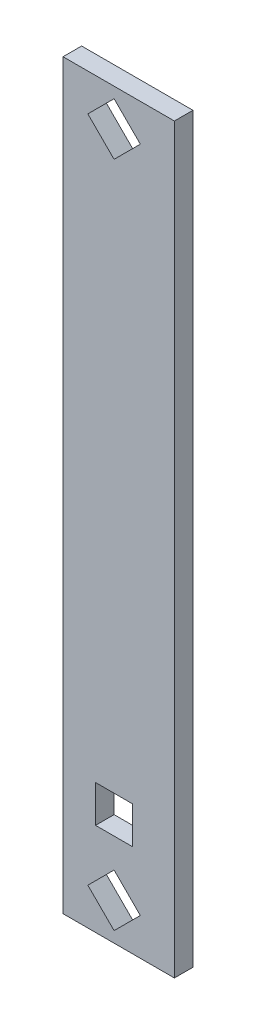
ISO-10303-21;
HEADER;
FILE_DESCRIPTION(('STEP AP214'),'2;1');
FILE_NAME('part.step','',(''),(''),'','','');
FILE_SCHEMA(('AUTOMOTIVE_DESIGN { 1 0 10303 214 1 1 1 1 }'));
ENDSEC;
DATA;
#1=APPLICATION_CONTEXT('core data for automotive mechanical design processes');
#2=APPLICATION_PROTOCOL_DEFINITION('international standard','automotive_design',2000,#1);
#3=PRODUCT_CONTEXT('',#1,'mechanical');
#4=PRODUCT('Part','Part','',(#3));
#5=PRODUCT_RELATED_PRODUCT_CATEGORY('part','',(#4));
#6=PRODUCT_DEFINITION_FORMATION('','',#4);
#7=PRODUCT_DEFINITION_CONTEXT('part definition',#1,'design');
#8=PRODUCT_DEFINITION('design','',#6,#7);
#9=PRODUCT_DEFINITION_SHAPE('','',#8);
#10=(LENGTH_UNIT() NAMED_UNIT(*) SI_UNIT(.MILLI.,.METRE.));
#11=(NAMED_UNIT(*) PLANE_ANGLE_UNIT() SI_UNIT($,.RADIAN.));
#12=(NAMED_UNIT(*) SI_UNIT($,.STERADIAN.) SOLID_ANGLE_UNIT());
#13=UNCERTAINTY_MEASURE_WITH_UNIT(LENGTH_MEASURE(1.E-05),#10,'distance_accuracy_value','');
#14=(GEOMETRIC_REPRESENTATION_CONTEXT(3) GLOBAL_UNCERTAINTY_ASSIGNED_CONTEXT((#13)) GLOBAL_UNIT_ASSIGNED_CONTEXT((#10,
#11,#12)) REPRESENTATION_CONTEXT('',''));
#15=CARTESIAN_POINT('',(0.,0.,0.));
#16=DIRECTION('',(0.,0.,1.));
#17=DIRECTION('',(1.,0.,0.));
#18=AXIS2_PLACEMENT_3D('',#15,#16,#17);
#19=CARTESIAN_POINT('',(-10.8340585797146,40.,-105.756692970029));
#20=DIRECTION('',(-1.,0.,0.));
#21=DIRECTION('',(0.,0.,1.));
#22=AXIS2_PLACEMENT_3D('',#19,#20,#21);
#23=PLANE('',#22);
#24=DIRECTION('',(0.,0.,-1.));
#25=VECTOR('',#24,1.);
#26=CARTESIAN_POINT('',(-10.8340585797146,0.,-105.756692970029));
#27=LINE('',#26,#25);
#28=CARTESIAN_POINT('',(-10.8340585797146,0.,-104.756692970029));
#29=VERTEX_POINT('',#28);
#30=CARTESIAN_POINT('',(-10.8340585797146,0.,-105.756692970029));
#31=VERTEX_POINT('',#30);
#32=EDGE_CURVE('E242',#29,#31,#27,.T.);
#33=ORIENTED_EDGE('',*,*,#32,.T.);
#34=DIRECTION('',(0.,-1.,0.));
#35=VECTOR('',#34,1.);
#36=CARTESIAN_POINT('',(-10.8340585797146,40.,-105.756692970029));
#37=LINE('',#36,#35);
#38=CARTESIAN_POINT('',(-10.8340585797146,40.,-105.756692970029));
#39=VERTEX_POINT('',#38);
#40=EDGE_CURVE('E11',#39,#31,#37,.T.);
#41=ORIENTED_EDGE('',*,*,#40,.F.);
#42=DIRECTION('',(0.,0.,-1.));
#43=VECTOR('',#42,1.);
#44=CARTESIAN_POINT('',(-10.8340585797146,40.,-105.756692970029));
#45=LINE('',#44,#43);
#46=CARTESIAN_POINT('',(-10.8340585797146,40.,-104.756692970029));
#47=VERTEX_POINT('',#46);
#48=EDGE_CURVE('E249',#47,#39,#45,.T.);
#49=ORIENTED_EDGE('',*,*,#48,.F.);
#50=DIRECTION('',(0.,-1.,0.));
#51=VECTOR('',#50,1.);
#52=CARTESIAN_POINT('',(-10.8340585797146,40.,-104.756692970029));
#53=LINE('',#52,#51);
#54=EDGE_CURVE('E259',#47,#29,#53,.T.);
#55=ORIENTED_EDGE('',*,*,#54,.T.);
#56=EDGE_LOOP('',(#33,#41,#49,#55));
#57=FACE_BOUND('',#56,.T.);
#58=ADVANCED_FACE('F36',(#57),#23,.F.);
#59=CARTESIAN_POINT('',(-10.8340585797146,40.,-105.756692970029));
#60=DIRECTION('',(0.,0.,1.));
#61=DIRECTION('',(1.,0.,0.));
#62=AXIS2_PLACEMENT_3D('',#59,#60,#61);
#63=PLANE('',#62);
#64=DIRECTION('',(-1.,0.,0.));
#65=VECTOR('',#64,1.);
#66=CARTESIAN_POINT('',(-15.0840585797146,7.,-105.756692970029));
#67=LINE('',#66,#65);
#68=CARTESIAN_POINT('',(-13.0840585797146,7.,-105.756692970029));
#69=VERTEX_POINT('',#68);
#70=CARTESIAN_POINT('',(-15.0840585797146,7.,-105.756692970029));
#71=VERTEX_POINT('',#70);
#72=EDGE_CURVE('E156',#69,#71,#67,.T.);
#73=ORIENTED_EDGE('',*,*,#72,.T.);
#74=DIRECTION('',(0.,-1.,0.));
#75=VECTOR('',#74,1.);
#76=CARTESIAN_POINT('',(-15.0840585797146,7.,-105.756692970029));
#77=LINE('',#76,#75);
#78=CARTESIAN_POINT('',(-15.0840585797146,5.,-105.756692970029));
#79=VERTEX_POINT('',#78);
#80=EDGE_CURVE('E150',#71,#79,#77,.T.);
#81=ORIENTED_EDGE('',*,*,#80,.T.);
#82=DIRECTION('',(1.,0.,0.));
#83=VECTOR('',#82,1.);
#84=CARTESIAN_POINT('',(-15.0840585797146,5.,-105.756692970029));
#85=LINE('',#84,#83);
#86=CARTESIAN_POINT('',(-13.0840585797146,5.,-105.756692970029));
#87=VERTEX_POINT('',#86);
#88=EDGE_CURVE('E159',#79,#87,#85,.T.);
#89=ORIENTED_EDGE('',*,*,#88,.T.);
#90=DIRECTION('',(0.,1.,0.));
#91=VECTOR('',#90,1.);
#92=CARTESIAN_POINT('',(-13.0840585797146,7.,-105.756692970029));
#93=LINE('',#92,#91);
#94=EDGE_CURVE('E50',#87,#69,#93,.T.);
#95=ORIENTED_EDGE('',*,*,#94,.T.);
#96=EDGE_LOOP('',(#73,#81,#89,#95));
#97=FACE_BOUND('',#96,.T.);
#98=DIRECTION('',(-0.707106781186548,-0.707106781186547,0.));
#99=VECTOR('',#98,1.);
#100=CARTESIAN_POINT('',(-12.6698450173415,38.,-105.756692970029));
#101=LINE('',#100,#99);
#102=CARTESIAN_POINT('',(-12.6698450173415,38.,-105.756692970029));
#103=VERTEX_POINT('',#102);
#104=CARTESIAN_POINT('',(-14.0840585797146,36.5857864376269,-105.756692970029));
#105=VERTEX_POINT('',#104);
#106=EDGE_CURVE('E187',#103,#105,#101,.T.);
#107=ORIENTED_EDGE('',*,*,#106,.F.);
#108=DIRECTION('',(0.707106781186546,-0.707106781186549,0.));
#109=VECTOR('',#108,1.);
#110=CARTESIAN_POINT('',(-14.0840585797146,39.4142135623731,-105.756692970029));
#111=LINE('',#110,#109);
#112=CARTESIAN_POINT('',(-14.0840585797146,39.4142135623731,-105.756692970029));
#113=VERTEX_POINT('',#112);
#114=EDGE_CURVE('E214',#113,#103,#111,.T.);
#115=ORIENTED_EDGE('',*,*,#114,.F.);
#116=DIRECTION('',(0.707106781186549,0.707106781186546,0.));
#117=VECTOR('',#116,1.);
#118=CARTESIAN_POINT('',(-15.4982721420877,38.,-105.756692970029));
#119=LINE('',#118,#117);
#120=CARTESIAN_POINT('',(-15.4982721420877,38.,-105.756692970029));
#121=VERTEX_POINT('',#120);
#122=EDGE_CURVE('E208',#121,#113,#119,.T.);
#123=ORIENTED_EDGE('',*,*,#122,.F.);
#124=DIRECTION('',(-0.707106781186547,0.707106781186548,0.));
#125=VECTOR('',#124,1.);
#126=CARTESIAN_POINT('',(-14.0840585797146,36.5857864376269,-105.756692970029));
#127=LINE('',#126,#125);
#128=EDGE_CURVE('E200',#105,#121,#127,.T.);
#129=ORIENTED_EDGE('',*,*,#128,.F.);
#130=EDGE_LOOP('',(#107,#115,#123,#129));
#131=FACE_BOUND('',#130,.T.);
#132=DIRECTION('',(0.707106781186549,-0.707106781186546,0.));
#133=VECTOR('',#132,1.);
#134=CARTESIAN_POINT('',(-15.4982721420877,2.,-105.756692970029));
#135=LINE('',#134,#133);
#136=CARTESIAN_POINT('',(-15.4982721420877,2.,-105.756692970029));
#137=VERTEX_POINT('',#136);
#138=CARTESIAN_POINT('',(-14.0840585797146,0.585786437626901,-105.756692970029));
#139=VERTEX_POINT('',#138);
#140=EDGE_CURVE('E227',#137,#139,#135,.T.);
#141=ORIENTED_EDGE('',*,*,#140,.T.);
#142=DIRECTION('',(0.707106781186546,0.707106781186549,0.));
#143=VECTOR('',#142,1.);
#144=CARTESIAN_POINT('',(-14.0840585797146,0.585786437626901,-105.756692970029));
#145=LINE('',#144,#143);
#146=CARTESIAN_POINT('',(-12.6698450173415,2.,-105.756692970029));
#147=VERTEX_POINT('',#146);
#148=EDGE_CURVE('E217',#139,#147,#145,.T.);
#149=ORIENTED_EDGE('',*,*,#148,.T.);
#150=DIRECTION('',(-0.707106781186548,0.707106781186547,0.));
#151=VECTOR('',#150,1.);
#152=CARTESIAN_POINT('',(-12.6698450173415,2.,-105.756692970029));
#153=LINE('',#152,#151);
#154=CARTESIAN_POINT('',(-14.0840585797146,3.4142135623731,-105.756692970029));
#155=VERTEX_POINT('',#154);
#156=EDGE_CURVE('E220',#147,#155,#153,.T.);
#157=ORIENTED_EDGE('',*,*,#156,.T.);
#158=DIRECTION('',(-0.707106781186547,-0.707106781186548,0.));
#159=VECTOR('',#158,1.);
#160=CARTESIAN_POINT('',(-14.0840585797146,3.4142135623731,-105.756692970029));
#161=LINE('',#160,#159);
#162=EDGE_CURVE('E224',#155,#137,#161,.T.);
#163=ORIENTED_EDGE('',*,*,#162,.T.);
#164=EDGE_LOOP('',(#141,#149,#157,#163));
#165=FACE_BOUND('',#164,.T.);
#166=DIRECTION('',(-1.,0.,0.));
#167=VECTOR('',#166,1.);
#168=CARTESIAN_POINT('',(-10.8340585797146,0.,-105.756692970029));
#169=LINE('',#168,#167);
#170=CARTESIAN_POINT('',(-16.8340585797146,0.,-105.756692970029));
#171=VERTEX_POINT('',#170);
#172=EDGE_CURVE('E262',#31,#171,#169,.T.);
#173=ORIENTED_EDGE('',*,*,#172,.T.);
#174=DIRECTION('',(0.,-1.,0.));
#175=VECTOR('',#174,1.);
#176=CARTESIAN_POINT('',(-16.8340585797146,40.,-105.756692970029));
#177=LINE('',#176,#175);
#178=CARTESIAN_POINT('',(-16.8340585797146,40.,-105.756692970029));
#179=VERTEX_POINT('',#178);
#180=EDGE_CURVE('E43',#179,#171,#177,.T.);
#181=ORIENTED_EDGE('',*,*,#180,.F.);
#182=DIRECTION('',(-1.,0.,0.));
#183=VECTOR('',#182,1.);
#184=CARTESIAN_POINT('',(-10.8340585797146,40.,-105.756692970029));
#185=LINE('',#184,#183);
#186=EDGE_CURVE('E252',#39,#179,#185,.T.);
#187=ORIENTED_EDGE('',*,*,#186,.F.);
#188=ORIENTED_EDGE('',*,*,#40,.T.);
#189=EDGE_LOOP('',(#173,#181,#187,#188));
#190=FACE_BOUND('',#189,.T.);
#191=ADVANCED_FACE('F163',(#97,#131,#165,#190),#63,.F.);
#192=CARTESIAN_POINT('',(-16.8340585797146,40.,-105.756692970029));
#193=DIRECTION('',(1.,0.,0.));
#194=DIRECTION('',(0.,0.,-1.));
#195=AXIS2_PLACEMENT_3D('',#192,#193,#194);
#196=PLANE('',#195);
#197=DIRECTION('',(0.,0.,1.));
#198=VECTOR('',#197,1.);
#199=CARTESIAN_POINT('',(-16.8340585797146,0.,-105.756692970029));
#200=LINE('',#199,#198);
#201=CARTESIAN_POINT('',(-16.8340585797146,0.,-104.756692970029));
#202=VERTEX_POINT('',#201);
#203=EDGE_CURVE('E264',#171,#202,#200,.T.);
#204=ORIENTED_EDGE('',*,*,#203,.T.);
#205=DIRECTION('',(0.,-1.,0.));
#206=VECTOR('',#205,1.);
#207=CARTESIAN_POINT('',(-16.8340585797146,40.,-104.756692970029));
#208=LINE('',#207,#206);
#209=CARTESIAN_POINT('',(-16.8340585797146,40.,-104.756692970029));
#210=VERTEX_POINT('',#209);
#211=EDGE_CURVE('E269',#210,#202,#208,.T.);
#212=ORIENTED_EDGE('',*,*,#211,.F.);
#213=DIRECTION('',(0.,0.,1.));
#214=VECTOR('',#213,1.);
#215=CARTESIAN_POINT('',(-16.8340585797146,40.,-105.756692970029));
#216=LINE('',#215,#214);
#217=EDGE_CURVE('E255',#179,#210,#216,.T.);
#218=ORIENTED_EDGE('',*,*,#217,.F.);
#219=ORIENTED_EDGE('',*,*,#180,.T.);
#220=EDGE_LOOP('',(#204,#212,#218,#219));
#221=FACE_BOUND('',#220,.T.);
#222=ADVANCED_FACE('F276',(#221),#196,.F.);
#223=CARTESIAN_POINT('',(-10.8340585797146,40.,-104.756692970029));
#224=DIRECTION('',(0.,0.,-1.));
#225=DIRECTION('',(-1.,0.,0.));
#226=AXIS2_PLACEMENT_3D('',#223,#224,#225);
#227=PLANE('',#226);
#228=DIRECTION('',(1.,0.,0.));
#229=VECTOR('',#228,1.);
#230=CARTESIAN_POINT('',(-15.0840585797146,5.,-104.756692970029));
#231=LINE('',#230,#229);
#232=CARTESIAN_POINT('',(-15.0840585797146,5.,-104.756692970029));
#233=VERTEX_POINT('',#232);
#234=CARTESIAN_POINT('',(-13.0840585797146,5.,-104.756692970029));
#235=VERTEX_POINT('',#234);
#236=EDGE_CURVE('E175',#233,#235,#231,.T.);
#237=ORIENTED_EDGE('',*,*,#236,.F.);
#238=DIRECTION('',(0.,-1.,0.));
#239=VECTOR('',#238,1.);
#240=CARTESIAN_POINT('',(-15.0840585797146,7.,-104.756692970029));
#241=LINE('',#240,#239);
#242=CARTESIAN_POINT('',(-15.0840585797146,7.,-104.756692970029));
#243=VERTEX_POINT('',#242);
#244=EDGE_CURVE('E58',#243,#233,#241,.T.);
#245=ORIENTED_EDGE('',*,*,#244,.F.);
#246=DIRECTION('',(-1.,0.,0.));
#247=VECTOR('',#246,1.);
#248=CARTESIAN_POINT('',(-15.0840585797146,7.,-104.756692970029));
#249=LINE('',#248,#247);
#250=CARTESIAN_POINT('',(-13.0840585797146,7.,-104.756692970029));
#251=VERTEX_POINT('',#250);
#252=EDGE_CURVE('E166',#251,#243,#249,.T.);
#253=ORIENTED_EDGE('',*,*,#252,.F.);
#254=DIRECTION('',(0.,1.,0.));
#255=VECTOR('',#254,1.);
#256=CARTESIAN_POINT('',(-13.0840585797146,7.,-104.756692970029));
#257=LINE('',#256,#255);
#258=EDGE_CURVE('E169',#235,#251,#257,.T.);
#259=ORIENTED_EDGE('',*,*,#258,.F.);
#260=EDGE_LOOP('',(#237,#245,#253,#259));
#261=FACE_BOUND('',#260,.T.);
#262=DIRECTION('',(0.707106781186549,0.707106781186546,0.));
#263=VECTOR('',#262,1.);
#264=CARTESIAN_POINT('',(-15.4982721420877,38.,-104.756692970029));
#265=LINE('',#264,#263);
#266=CARTESIAN_POINT('',(-15.4982721420877,38.,-104.756692970029));
#267=VERTEX_POINT('',#266);
#268=CARTESIAN_POINT('',(-14.0840585797146,39.4142135623731,-104.756692970029));
#269=VERTEX_POINT('',#268);
#270=EDGE_CURVE('E203',#267,#269,#265,.T.);
#271=ORIENTED_EDGE('',*,*,#270,.T.);
#272=DIRECTION('',(0.707106781186546,-0.707106781186549,0.));
#273=VECTOR('',#272,1.);
#274=CARTESIAN_POINT('',(-14.0840585797146,39.4142135623731,-104.756692970029));
#275=LINE('',#274,#273);
#276=CARTESIAN_POINT('',(-12.6698450173415,38.,-104.756692970029));
#277=VERTEX_POINT('',#276);
#278=EDGE_CURVE('E211',#269,#277,#275,.T.);
#279=ORIENTED_EDGE('',*,*,#278,.T.);
#280=DIRECTION('',(-0.707106781186548,-0.707106781186547,0.));
#281=VECTOR('',#280,1.);
#282=CARTESIAN_POINT('',(-12.6698450173415,38.,-104.756692970029));
#283=LINE('',#282,#281);
#284=CARTESIAN_POINT('',(-14.0840585797146,36.5857864376269,-104.756692970029));
#285=VERTEX_POINT('',#284);
#286=EDGE_CURVE('E181',#277,#285,#283,.T.);
#287=ORIENTED_EDGE('',*,*,#286,.T.);
#288=DIRECTION('',(-0.707106781186547,0.707106781186548,0.));
#289=VECTOR('',#288,1.);
#290=CARTESIAN_POINT('',(-14.0840585797146,36.5857864376269,-104.756692970029));
#291=LINE('',#290,#289);
#292=EDGE_CURVE('E195',#285,#267,#291,.T.);
#293=ORIENTED_EDGE('',*,*,#292,.T.);
#294=EDGE_LOOP('',(#271,#279,#287,#293));
#295=FACE_BOUND('',#294,.T.);
#296=DIRECTION('',(-0.707106781186548,0.707106781186547,0.));
#297=VECTOR('',#296,1.);
#298=CARTESIAN_POINT('',(-12.6698450173415,2.,-104.756692970029));
#299=LINE('',#298,#297);
#300=CARTESIAN_POINT('',(-12.6698450173415,2.00000000000001,-104.756692970029));
#301=VERTEX_POINT('',#300);
#302=CARTESIAN_POINT('',(-14.0840585797146,3.4142135623731,-104.756692970029));
#303=VERTEX_POINT('',#302);
#304=EDGE_CURVE('E232',#301,#303,#299,.T.);
#305=ORIENTED_EDGE('',*,*,#304,.F.);
#306=DIRECTION('',(0.707106781186546,0.707106781186549,0.));
#307=VECTOR('',#306,1.);
#308=CARTESIAN_POINT('',(-14.0840585797146,0.585786437626901,-104.756692970029));
#309=LINE('',#308,#307);
#310=CARTESIAN_POINT('',(-14.0840585797146,0.585786437626901,-104.756692970029));
#311=VERTEX_POINT('',#310);
#312=EDGE_CURVE('E216',#311,#301,#309,.T.);
#313=ORIENTED_EDGE('',*,*,#312,.F.);
#314=DIRECTION('',(0.707106781186549,-0.707106781186546,0.));
#315=VECTOR('',#314,1.);
#316=CARTESIAN_POINT('',(-15.4982721420877,2.,-104.756692970029));
#317=LINE('',#316,#315);
#318=CARTESIAN_POINT('',(-15.4982721420877,2.,-104.756692970029));
#319=VERTEX_POINT('',#318);
#320=EDGE_CURVE('E221',#319,#311,#317,.T.);
#321=ORIENTED_EDGE('',*,*,#320,.F.);
#322=DIRECTION('',(-0.707106781186547,-0.707106781186548,0.));
#323=VECTOR('',#322,1.);
#324=CARTESIAN_POINT('',(-14.0840585797146,3.4142135623731,-104.756692970029));
#325=LINE('',#324,#323);
#326=EDGE_CURVE('E235',#303,#319,#325,.T.);
#327=ORIENTED_EDGE('',*,*,#326,.F.);
#328=EDGE_LOOP('',(#305,#313,#321,#327));
#329=FACE_BOUND('',#328,.T.);
#330=DIRECTION('',(1.,0.,0.));
#331=VECTOR('',#330,1.);
#332=CARTESIAN_POINT('',(-10.8340585797146,0.,-104.756692970029));
#333=LINE('',#332,#331);
#334=EDGE_CURVE('E253',#202,#29,#333,.T.);
#335=ORIENTED_EDGE('',*,*,#334,.T.);
#336=ORIENTED_EDGE('',*,*,#54,.F.);
#337=DIRECTION('',(1.,0.,0.));
#338=VECTOR('',#337,1.);
#339=CARTESIAN_POINT('',(-10.8340585797146,40.,-104.756692970029));
#340=LINE('',#339,#338);
#341=EDGE_CURVE('E257',#210,#47,#340,.T.);
#342=ORIENTED_EDGE('',*,*,#341,.F.);
#343=ORIENTED_EDGE('',*,*,#211,.T.);
#344=EDGE_LOOP('',(#335,#336,#342,#343));
#345=FACE_BOUND('',#344,.T.);
#346=ADVANCED_FACE('F285',(#261,#295,#329,#345),#227,.F.);
#347=CARTESIAN_POINT('',(0.,40.,0.));
#348=DIRECTION('',(0.,-1.,0.));
#349=DIRECTION('',(0.,0.,-1.));
#350=AXIS2_PLACEMENT_3D('',#347,#348,#349);
#351=PLANE('',#350);
#352=ORIENTED_EDGE('',*,*,#48,.T.);
#353=ORIENTED_EDGE('',*,*,#186,.T.);
#354=ORIENTED_EDGE('',*,*,#217,.T.);
#355=ORIENTED_EDGE('',*,*,#341,.T.);
#356=EDGE_LOOP('',(#352,#353,#354,#355));
#357=FACE_BOUND('',#356,.T.);
#358=ADVANCED_FACE('F291',(#357),#351,.F.);
#359=CARTESIAN_POINT('',(0.,0.,0.));
#360=DIRECTION('',(0.,-1.,0.));
#361=DIRECTION('',(0.,0.,-1.));
#362=AXIS2_PLACEMENT_3D('',#359,#360,#361);
#363=PLANE('',#362);
#364=ORIENTED_EDGE('',*,*,#32,.F.);
#365=ORIENTED_EDGE('',*,*,#334,.F.);
#366=ORIENTED_EDGE('',*,*,#203,.F.);
#367=ORIENTED_EDGE('',*,*,#172,.F.);
#368=EDGE_LOOP('',(#364,#365,#366,#367));
#369=FACE_BOUND('',#368,.T.);
#370=ADVANCED_FACE('F282',(#369),#363,.T.);
#371=CARTESIAN_POINT('',(-14.0840585797146,0.585786437626901,-105.756692970029));
#372=DIRECTION('',(0.707106781186549,-0.707106781186546,0.));
#373=DIRECTION('',(0.707106781186546,0.707106781186549,0.));
#374=AXIS2_PLACEMENT_3D('',#371,#372,#373);
#375=PLANE('',#374);
#376=ORIENTED_EDGE('',*,*,#312,.T.);
#377=DIRECTION('',(0.,0.,1.));
#378=VECTOR('',#377,1.);
#379=CARTESIAN_POINT('',(-12.6698450173415,2.,-105.756692970029));
#380=LINE('',#379,#378);
#381=EDGE_CURVE('E230',#147,#301,#380,.T.);
#382=ORIENTED_EDGE('',*,*,#381,.F.);
#383=ORIENTED_EDGE('',*,*,#148,.F.);
#384=DIRECTION('',(0.,0.,1.));
#385=VECTOR('',#384,1.);
#386=CARTESIAN_POINT('',(-14.0840585797146,0.585786437626901,-105.756692970029));
#387=LINE('',#386,#385);
#388=EDGE_CURVE('E240',#139,#311,#387,.T.);
#389=ORIENTED_EDGE('',*,*,#388,.T.);
#390=EDGE_LOOP('',(#376,#382,#383,#389));
#391=FACE_BOUND('',#390,.T.);
#392=ADVANCED_FACE('F304',(#391),#375,.F.);
#393=CARTESIAN_POINT('',(-15.4982721420877,2.,-105.756692970029));
#394=DIRECTION('',(-0.707106781186546,-0.707106781186549,0.));
#395=DIRECTION('',(0.707106781186549,-0.707106781186546,0.));
#396=AXIS2_PLACEMENT_3D('',#393,#394,#395);
#397=PLANE('',#396);
#398=ORIENTED_EDGE('',*,*,#320,.T.);
#399=ORIENTED_EDGE('',*,*,#388,.F.);
#400=ORIENTED_EDGE('',*,*,#140,.F.);
#401=DIRECTION('',(0.,0.,1.));
#402=VECTOR('',#401,1.);
#403=CARTESIAN_POINT('',(-15.4982721420877,2.,-105.756692970029));
#404=LINE('',#403,#402);
#405=EDGE_CURVE('E243',#137,#319,#404,.T.);
#406=ORIENTED_EDGE('',*,*,#405,.T.);
#407=EDGE_LOOP('',(#398,#399,#400,#406));
#408=FACE_BOUND('',#407,.T.);
#409=ADVANCED_FACE('F309',(#408),#397,.F.);
#410=CARTESIAN_POINT('',(-14.0840585797146,3.4142135623731,-105.756692970029));
#411=DIRECTION('',(-0.707106781186548,0.707106781186547,0.));
#412=DIRECTION('',(-0.707106781186547,-0.707106781186548,0.));
#413=AXIS2_PLACEMENT_3D('',#410,#411,#412);
#414=PLANE('',#413);
#415=ORIENTED_EDGE('',*,*,#326,.T.);
#416=ORIENTED_EDGE('',*,*,#405,.F.);
#417=ORIENTED_EDGE('',*,*,#162,.F.);
#418=DIRECTION('',(0.,0.,1.));
#419=VECTOR('',#418,1.);
#420=CARTESIAN_POINT('',(-14.0840585797146,3.4142135623731,-105.756692970029));
#421=LINE('',#420,#419);
#422=EDGE_CURVE('E245',#155,#303,#421,.T.);
#423=ORIENTED_EDGE('',*,*,#422,.T.);
#424=EDGE_LOOP('',(#415,#416,#417,#423));
#425=FACE_BOUND('',#424,.T.);
#426=ADVANCED_FACE('F315',(#425),#414,.F.);
#427=CARTESIAN_POINT('',(-12.6698450173415,2.,-105.756692970029));
#428=DIRECTION('',(0.707106781186547,0.707106781186548,0.));
#429=DIRECTION('',(-0.707106781186548,0.707106781186547,0.));
#430=AXIS2_PLACEMENT_3D('',#427,#428,#429);
#431=PLANE('',#430);
#432=ORIENTED_EDGE('',*,*,#304,.T.);
#433=ORIENTED_EDGE('',*,*,#422,.F.);
#434=ORIENTED_EDGE('',*,*,#156,.F.);
#435=ORIENTED_EDGE('',*,*,#381,.T.);
#436=EDGE_LOOP('',(#432,#433,#434,#435));
#437=FACE_BOUND('',#436,.T.);
#438=ADVANCED_FACE('F311',(#437),#431,.F.);
#439=CARTESIAN_POINT('',(-14.0840585797146,39.4142135623731,-105.756692970029));
#440=DIRECTION('',(0.707106781186549,0.707106781186546,0.));
#441=DIRECTION('',(0.707106781186546,-0.707106781186549,0.));
#442=AXIS2_PLACEMENT_3D('',#439,#440,#441);
#443=PLANE('',#442);
#444=ORIENTED_EDGE('',*,*,#278,.F.);
#445=DIRECTION('',(0.,0.,1.));
#446=VECTOR('',#445,1.);
#447=CARTESIAN_POINT('',(-14.0840585797146,39.4142135623731,-105.756692970029));
#448=LINE('',#447,#446);
#449=EDGE_CURVE('E206',#113,#269,#448,.T.);
#450=ORIENTED_EDGE('',*,*,#449,.F.);
#451=ORIENTED_EDGE('',*,*,#114,.T.);
#452=DIRECTION('',(0.,0.,1.));
#453=VECTOR('',#452,1.);
#454=CARTESIAN_POINT('',(-12.6698450173415,38.,-105.756692970029));
#455=LINE('',#454,#453);
#456=EDGE_CURVE('E193',#103,#277,#455,.T.);
#457=ORIENTED_EDGE('',*,*,#456,.T.);
#458=EDGE_LOOP('',(#444,#450,#451,#457));
#459=FACE_BOUND('',#458,.T.);
#460=ADVANCED_FACE('F314',(#459),#443,.F.);
#461=CARTESIAN_POINT('',(-15.4982721420877,38.,-105.756692970029));
#462=DIRECTION('',(-0.707106781186546,0.707106781186549,0.));
#463=DIRECTION('',(0.707106781186549,0.707106781186546,0.));
#464=AXIS2_PLACEMENT_3D('',#461,#462,#463);
#465=PLANE('',#464);
#466=ORIENTED_EDGE('',*,*,#270,.F.);
#467=DIRECTION('',(0.,0.,1.));
#468=VECTOR('',#467,1.);
#469=CARTESIAN_POINT('',(-15.4982721420877,38.,-105.756692970029));
#470=LINE('',#469,#468);
#471=EDGE_CURVE('E198',#121,#267,#470,.T.);
#472=ORIENTED_EDGE('',*,*,#471,.F.);
#473=ORIENTED_EDGE('',*,*,#122,.T.);
#474=ORIENTED_EDGE('',*,*,#449,.T.);
#475=EDGE_LOOP('',(#466,#472,#473,#474));
#476=FACE_BOUND('',#475,.T.);
#477=ADVANCED_FACE('F325',(#476),#465,.F.);
#478=CARTESIAN_POINT('',(-14.0840585797146,36.5857864376269,-105.756692970029));
#479=DIRECTION('',(-0.707106781186548,-0.707106781186547,0.));
#480=DIRECTION('',(-0.707106781186547,0.707106781186548,0.));
#481=AXIS2_PLACEMENT_3D('',#478,#479,#480);
#482=PLANE('',#481);
#483=ORIENTED_EDGE('',*,*,#292,.F.);
#484=DIRECTION('',(0.,0.,1.));
#485=VECTOR('',#484,1.);
#486=CARTESIAN_POINT('',(-14.0840585797146,36.5857864376269,-105.756692970029));
#487=LINE('',#486,#485);
#488=EDGE_CURVE('E190',#105,#285,#487,.T.);
#489=ORIENTED_EDGE('',*,*,#488,.F.);
#490=ORIENTED_EDGE('',*,*,#128,.T.);
#491=ORIENTED_EDGE('',*,*,#471,.T.);
#492=EDGE_LOOP('',(#483,#489,#490,#491));
#493=FACE_BOUND('',#492,.T.);
#494=ADVANCED_FACE('F329',(#493),#482,.F.);
#495=CARTESIAN_POINT('',(-12.6698450173415,38.,-105.756692970029));
#496=DIRECTION('',(0.707106781186547,-0.707106781186548,0.));
#497=DIRECTION('',(-0.707106781186548,-0.707106781186547,0.));
#498=AXIS2_PLACEMENT_3D('',#495,#496,#497);
#499=PLANE('',#498);
#500=ORIENTED_EDGE('',*,*,#286,.F.);
#501=ORIENTED_EDGE('',*,*,#456,.F.);
#502=ORIENTED_EDGE('',*,*,#106,.T.);
#503=ORIENTED_EDGE('',*,*,#488,.T.);
#504=EDGE_LOOP('',(#500,#501,#502,#503));
#505=FACE_BOUND('',#504,.T.);
#506=ADVANCED_FACE('F333',(#505),#499,.F.);
#507=CARTESIAN_POINT('',(-15.0840585797146,7.,-105.756692970029));
#508=DIRECTION('',(-1.,0.,0.));
#509=DIRECTION('',(0.,-1.,0.));
#510=AXIS2_PLACEMENT_3D('',#507,#508,#509);
#511=PLANE('',#510);
#512=ORIENTED_EDGE('',*,*,#244,.T.);
#513=DIRECTION('',(0.,0.,1.));
#514=VECTOR('',#513,1.);
#515=CARTESIAN_POINT('',(-15.0840585797146,5.,-105.756692970029));
#516=LINE('',#515,#514);
#517=EDGE_CURVE('E146',#79,#233,#516,.T.);
#518=ORIENTED_EDGE('',*,*,#517,.F.);
#519=ORIENTED_EDGE('',*,*,#80,.F.);
#520=DIRECTION('',(0.,0.,1.));
#521=VECTOR('',#520,1.);
#522=CARTESIAN_POINT('',(-15.0840585797146,7.,-105.756692970029));
#523=LINE('',#522,#521);
#524=EDGE_CURVE('E179',#71,#243,#523,.T.);
#525=ORIENTED_EDGE('',*,*,#524,.T.);
#526=EDGE_LOOP('',(#512,#518,#519,#525));
#527=FACE_BOUND('',#526,.T.);
#528=ADVANCED_FACE('F148',(#527),#511,.F.);
#529=CARTESIAN_POINT('',(-15.0840585797146,7.,-105.756692970029));
#530=DIRECTION('',(0.,1.,0.));
#531=DIRECTION('',(0.,0.,1.));
#532=AXIS2_PLACEMENT_3D('',#529,#530,#531);
#533=PLANE('',#532);
#534=ORIENTED_EDGE('',*,*,#252,.T.);
#535=ORIENTED_EDGE('',*,*,#524,.F.);
#536=ORIENTED_EDGE('',*,*,#72,.F.);
#537=DIRECTION('',(0.,0.,1.));
#538=VECTOR('',#537,1.);
#539=CARTESIAN_POINT('',(-13.0840585797146,7.,-105.756692970029));
#540=LINE('',#539,#538);
#541=EDGE_CURVE('E182',#69,#251,#540,.T.);
#542=ORIENTED_EDGE('',*,*,#541,.T.);
#543=EDGE_LOOP('',(#534,#535,#536,#542));
#544=FACE_BOUND('',#543,.T.);
#545=ADVANCED_FACE('F340',(#544),#533,.F.);
#546=CARTESIAN_POINT('',(-13.0840585797146,7.,-105.756692970029));
#547=DIRECTION('',(1.,0.,0.));
#548=DIRECTION('',(0.,1.,0.));
#549=AXIS2_PLACEMENT_3D('',#546,#547,#548);
#550=PLANE('',#549);
#551=ORIENTED_EDGE('',*,*,#258,.T.);
#552=ORIENTED_EDGE('',*,*,#541,.F.);
#553=ORIENTED_EDGE('',*,*,#94,.F.);
#554=DIRECTION('',(0.,0.,1.));
#555=VECTOR('',#554,1.);
#556=CARTESIAN_POINT('',(-13.0840585797146,5.,-105.756692970029));
#557=LINE('',#556,#555);
#558=EDGE_CURVE('E155',#87,#235,#557,.T.);
#559=ORIENTED_EDGE('',*,*,#558,.T.);
#560=EDGE_LOOP('',(#551,#552,#553,#559));
#561=FACE_BOUND('',#560,.T.);
#562=ADVANCED_FACE('F343',(#561),#550,.F.);
#563=CARTESIAN_POINT('',(-15.0840585797146,5.,-105.756692970029));
#564=DIRECTION('',(0.,-1.,0.));
#565=DIRECTION('',(0.,0.,-1.));
#566=AXIS2_PLACEMENT_3D('',#563,#564,#565);
#567=PLANE('',#566);
#568=ORIENTED_EDGE('',*,*,#236,.T.);
#569=ORIENTED_EDGE('',*,*,#558,.F.);
#570=ORIENTED_EDGE('',*,*,#88,.F.);
#571=ORIENTED_EDGE('',*,*,#517,.T.);
#572=EDGE_LOOP('',(#568,#569,#570,#571));
#573=FACE_BOUND('',#572,.T.);
#574=ADVANCED_FACE('F160',(#573),#567,.F.);
#575=CLOSED_SHELL('',(#58,#191,#222,#346,#358,#370,#392,#409,#426,#438,#460,#477,#494,#506,#528,
#545,#562,#574));
#576=MANIFOLD_SOLID_BREP('B2',#575);
#577=ADVANCED_BREP_SHAPE_REPRESENTATION('',(#18,#576),#14);
#578=SHAPE_DEFINITION_REPRESENTATION(#9,#577);
ENDSEC;
END-ISO-10303-21;
